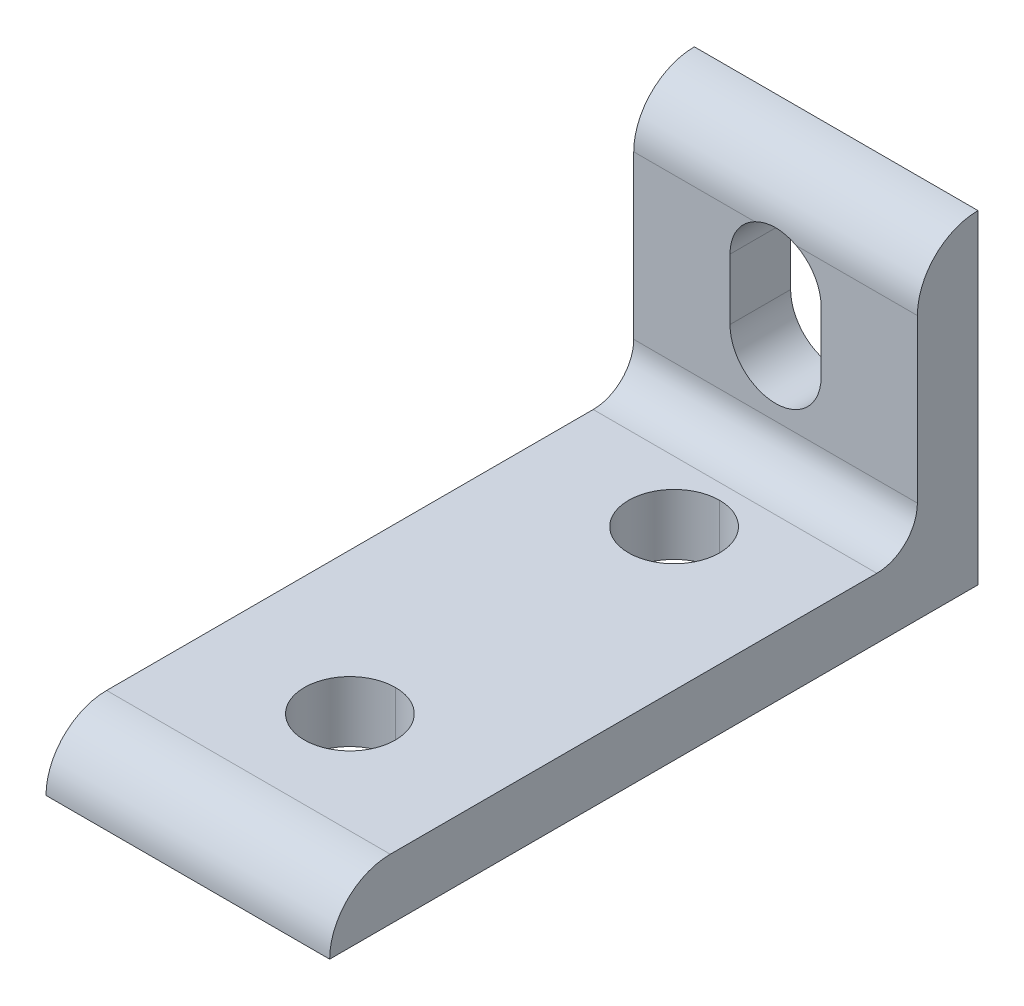
ISO-10303-21;
HEADER;
FILE_DESCRIPTION(('STEP AP214'),'2;1');
FILE_NAME('part.step','',(''),(''),'','','');
FILE_SCHEMA(('AUTOMOTIVE_DESIGN { 1 0 10303 214 1 1 1 1 }'));
ENDSEC;
DATA;
#1=APPLICATION_CONTEXT('core data for automotive mechanical design processes');
#2=APPLICATION_PROTOCOL_DEFINITION('international standard','automotive_design',2000,#1);
#3=PRODUCT_CONTEXT('',#1,'mechanical');
#4=PRODUCT('Part','Part','',(#3));
#5=PRODUCT_RELATED_PRODUCT_CATEGORY('part','',(#4));
#6=PRODUCT_DEFINITION_FORMATION('','',#4);
#7=PRODUCT_DEFINITION_CONTEXT('part definition',#1,'design');
#8=PRODUCT_DEFINITION('design','',#6,#7);
#9=PRODUCT_DEFINITION_SHAPE('','',#8);
#10=(LENGTH_UNIT() NAMED_UNIT(*) SI_UNIT(.MILLI.,.METRE.));
#11=(NAMED_UNIT(*) PLANE_ANGLE_UNIT() SI_UNIT($,.RADIAN.));
#12=(NAMED_UNIT(*) SI_UNIT($,.STERADIAN.) SOLID_ANGLE_UNIT());
#13=UNCERTAINTY_MEASURE_WITH_UNIT(LENGTH_MEASURE(1.E-05),#10,'distance_accuracy_value','');
#14=(GEOMETRIC_REPRESENTATION_CONTEXT(3) GLOBAL_UNCERTAINTY_ASSIGNED_CONTEXT((#13)) GLOBAL_UNIT_ASSIGNED_CONTEXT((#10,
#11,#12)) REPRESENTATION_CONTEXT('',''));
#15=CARTESIAN_POINT('',(0.,0.,0.));
#16=DIRECTION('',(0.,0.,1.));
#17=DIRECTION('',(1.,0.,0.));
#18=AXIS2_PLACEMENT_3D('',#15,#16,#17);
#19=CARTESIAN_POINT('',(11.1125,20.6501999999996,-3.83373888190875E-13));
#20=DIRECTION('',(-1.,0.,0.));
#21=DIRECTION('',(0.,-0.707106781186549,-0.707106781186546));
#22=AXIS2_PLACEMENT_3D('',#19,#20,#21);
#23=CYLINDRICAL_SURFACE('',#22,4.74980000000038);
#24=CARTESIAN_POINT('',(1.62941544426215,20.6502,4.7498));
#25=CARTESIAN_POINT('',(1.58771081475754,20.6716034856698,4.74979974663532));
#26=CARTESIAN_POINT('',(1.54558425612767,20.6921841983574,4.74966851430968));
#27=CARTESIAN_POINT('',(1.46044579112191,20.7317204261948,4.74919246835392));
#28=CARTESIAN_POINT('',(1.41743190130385,20.7506716639528,4.74884711102947));
#29=CARTESIAN_POINT('',(1.33061351037316,20.7868920036165,4.74799093163442));
#30=CARTESIAN_POINT('',(1.28680773953131,20.8041580547705,4.74747981645889));
#31=CARTESIAN_POINT('',(1.19850462397126,20.836959486562,4.74633992900316));
#32=CARTESIAN_POINT('',(1.15400663129361,20.8524931187037,4.74571103954002));
#33=CARTESIAN_POINT('',(1.06442158531662,20.8817888826184,4.74438361323167));
#34=CARTESIAN_POINT('',(1.0193344057291,20.8955506275045,4.74368506123472));
#35=CARTESIAN_POINT('',(0.928676402628855,20.921270030396,4.74226626330767));
#36=CARTESIAN_POINT('',(0.883105868220467,20.9332287081759,4.74154602991872));
#37=CARTESIAN_POINT('',(0.791588800347899,20.955317768452,4.74013228917699));
#38=CARTESIAN_POINT('',(0.745642860304988,20.9654506073167,4.7394387469192));
#39=CARTESIAN_POINT('',(0.653484208680454,20.9838723251786,4.73812544793173));
#40=CARTESIAN_POINT('',(0.607272280405272,20.9921651116181,4.73750553617148));
#41=CARTESIAN_POINT('',(0.514657127790422,21.0069052008294,4.73639155213394));
#42=CARTESIAN_POINT('',(0.46825454276931,21.0133564996596,4.73589720763457));
#43=CARTESIAN_POINT('',(0.375134719315914,21.0244388838199,4.73506581396674));
#44=CARTESIAN_POINT('',(0.328417031160237,21.0290662151868,4.73472908893554));
#45=CARTESIAN_POINT('',(0.234732091815051,21.0364825419295,4.73420023725051));
#46=CARTESIAN_POINT('',(0.187764518046458,21.0392674850632,4.7340084292038));
#47=CARTESIAN_POINT('',(0.0936895393163097,21.0429809694374,4.73376591374445));
#48=CARTESIAN_POINT('',(0.0465820306009302,21.0439068954656,4.73371540506853));
#49=CARTESIAN_POINT('',(-0.0476619701041502,21.0438930228934,4.73374970108751));
#50=CARTESIAN_POINT('',(-0.0947984618903732,21.0429520630801,4.73383458999398));
#51=CARTESIAN_POINT('',(-0.188989199584479,21.0392039144651,4.73413443720792));
#52=CARTESIAN_POINT('',(-0.236043457466747,21.0363970248882,4.73434937465999));
#53=CARTESIAN_POINT('',(-0.3299588028127,21.0289253361312,4.73490414345228));
#54=CARTESIAN_POINT('',(-0.376820030649899,21.0242622924687,4.7352438567583));
#55=CARTESIAN_POINT('',(-0.47023941085494,21.0130953812573,4.73604213350941));
#56=CARTESIAN_POINT('',(-0.516797947184081,21.0065947108632,4.73650049041925));
#57=CARTESIAN_POINT('',(-0.609503693282869,20.991778287716,4.7375333609251));
#58=CARTESIAN_POINT('',(-0.655651643786119,20.9834671487465,4.73810757899205));
#59=CARTESIAN_POINT('',(-0.7475553673972,20.965038941085,4.73935864458335));
#60=CARTESIAN_POINT('',(-0.79331135871949,20.9549229563624,4.74003543047012));
#61=CARTESIAN_POINT('',(-0.884478989736967,20.9328755701145,4.7414265065075));
#62=CARTESIAN_POINT('',(-0.929889770496905,20.9209406213697,4.74214086811328));
#63=CARTESIAN_POINT('',(-1.02025908404943,20.8952731110481,4.74355894802424));
#64=CARTESIAN_POINT('',(-1.06521701367042,20.8815384250336,4.74426265263708));
#65=CARTESIAN_POINT('',(-1.15457409774702,20.8522977382991,4.74560627284924));
#66=CARTESIAN_POINT('',(-1.19897302047046,20.8367910282061,4.74624616270905));
#67=CARTESIAN_POINT('',(-1.28710795782765,20.8040409555758,4.74741022276379));
#68=CARTESIAN_POINT('',(-1.33084421903748,20.7867982582136,4.74793443703802));
#69=CARTESIAN_POINT('',(-1.41755271520108,20.7506187491641,4.74881487388937));
#70=CARTESIAN_POINT('',(-1.46052577580067,20.7316839212114,4.74917129018523));
#71=CARTESIAN_POINT('',(-1.54561058696089,20.6921713333414,4.74966352331007));
#72=CARTESIAN_POINT('',(-1.58772383502101,20.6715968030771,4.749799763069));
#73=CARTESIAN_POINT('',(-1.62941544426216,20.6502,4.7498));
#74=B_SPLINE_CURVE_WITH_KNOTS('',3,(#24,#25,#26,#27,#28,#29,#30,#31,#32,#33,#34,#35,#36,#37,#38,
#39,#40,#41,#42,#43,#44,#45,#46,#47,#48,#49,#50,#51,#52,#53,#54,#55,#56,#57,#58,#59,#60,#61,#62,
#63,#64,#65,#66,#67,#68,#69,#70,#71,#72,#73),.UNSPECIFIED.,.F.,.F.,(4,2,2,2,2,2,2,2,2,2,2,2,2,2,
2,2,2,2,2,2,2,2,2,2,4),(0.,0.140619147105535,0.281596817120042,0.422825145757395,
0.564194747466598,0.70559516469195,0.846915306564409,0.988043882152585,1.12886983337309,
1.26938782549957,1.41019353053859,1.55130791016503,1.69262066678115,1.83402134823024,
1.97539935979175,2.1166439750222,2.25764434557146,2.39828951008736,2.5388504873747,
2.679689169978,2.82069562410569,2.96175872470758,3.10276797866124,3.24361403917691,
3.38418923013093),.UNSPECIFIED.);
#75=CARTESIAN_POINT('',(1.62941544426215,20.6502,4.7498));
#76=VERTEX_POINT('',#75);
#77=CARTESIAN_POINT('',(-1.62941544426215,20.6502,4.7498));
#78=VERTEX_POINT('',#77);
#79=EDGE_CURVE('E11',#76,#78,#74,.T.);
#80=ORIENTED_EDGE('',*,*,#79,.F.);
#81=DIRECTION('',(-1.,0.,0.));
#82=VECTOR('',#81,1.);
#83=CARTESIAN_POINT('',(11.1125,20.6502,4.7498));
#84=LINE('',#83,#82);
#85=CARTESIAN_POINT('',(11.1125,20.6502,4.7498));
#86=VERTEX_POINT('',#85);
#87=EDGE_CURVE('E26',#86,#76,#84,.T.);
#88=ORIENTED_EDGE('',*,*,#87,.F.);
#89=CARTESIAN_POINT('',(11.1125,20.6501999999996,-3.83373888190875E-13));
#90=DIRECTION('',(1.,0.,0.));
#91=DIRECTION('',(0.,0.,-1.));
#92=AXIS2_PLACEMENT_3D('',#89,#90,#91);
#93=CIRCLE('',#92,4.74980000000038);
#94=CARTESIAN_POINT('',(11.1125,25.4,0.));
#95=VERTEX_POINT('',#94);
#96=EDGE_CURVE('E239',#95,#86,#93,.T.);
#97=ORIENTED_EDGE('',*,*,#96,.F.);
#98=DIRECTION('',(-1.,0.,0.));
#99=VECTOR('',#98,1.);
#100=CARTESIAN_POINT('',(11.1125,25.4,0.));
#101=LINE('',#100,#99);
#102=CARTESIAN_POINT('',(-11.1125,25.4,0.));
#103=VERTEX_POINT('',#102);
#104=EDGE_CURVE('E235',#95,#103,#101,.T.);
#105=ORIENTED_EDGE('',*,*,#104,.T.);
#106=CARTESIAN_POINT('',(-11.1125,20.6501999999996,-3.83373888190875E-13));
#107=DIRECTION('',(1.,0.,0.));
#108=DIRECTION('',(0.,0.,-1.));
#109=AXIS2_PLACEMENT_3D('',#106,#107,#108);
#110=CIRCLE('',#109,4.74980000000038);
#111=CARTESIAN_POINT('',(-11.1125,20.6502,4.7498));
#112=VERTEX_POINT('',#111);
#113=EDGE_CURVE('E231',#103,#112,#110,.T.);
#114=ORIENTED_EDGE('',*,*,#113,.T.);
#115=DIRECTION('',(-1.,0.,0.));
#116=VECTOR('',#115,1.);
#117=CARTESIAN_POINT('',(11.1125,20.6502,4.7498));
#118=LINE('',#117,#116);
#119=EDGE_CURVE('E213',#78,#112,#118,.T.);
#120=ORIENTED_EDGE('',*,*,#119,.F.);
#121=EDGE_LOOP('',(#80,#88,#97,#105,#114,#120));
#122=FACE_BOUND('',#121,.T.);
#123=ADVANCED_FACE('F17',(#122),#23,.T.);
#124=CARTESIAN_POINT('',(11.1125,20.6502,4.7498));
#125=DIRECTION('',(0.,0.,-1.));
#126=DIRECTION('',(-1.,0.,0.));
#127=AXIS2_PLACEMENT_3D('',#124,#125,#126);
#128=PLANE('',#127);
#129=CARTESIAN_POINT('',(0.,17.4752,4.7498));
#130=DIRECTION('',(0.,0.,1.));
#131=DIRECTION('',(-1.,0.,0.));
#132=AXIS2_PLACEMENT_3D('',#129,#130,#131);
#133=CIRCLE('',#132,3.5687);
#134=CARTESIAN_POINT('',(3.5687,17.4752,4.7498));
#135=VERTEX_POINT('',#134);
#136=EDGE_CURVE('E209',#135,#76,#133,.T.);
#137=ORIENTED_EDGE('',*,*,#136,.F.);
#138=DIRECTION('',(0.,1.,0.));
#139=VECTOR('',#138,1.);
#140=CARTESIAN_POINT('',(3.5687,20.6502,4.7498));
#141=LINE('',#140,#139);
#142=CARTESIAN_POINT('',(3.5687,12.7,4.7498));
#143=VERTEX_POINT('',#142);
#144=EDGE_CURVE('E211',#143,#135,#141,.T.);
#145=ORIENTED_EDGE('',*,*,#144,.F.);
#146=CARTESIAN_POINT('',(0.,12.7,4.7498));
#147=DIRECTION('',(0.,0.,1.));
#148=DIRECTION('',(-1.,0.,0.));
#149=AXIS2_PLACEMENT_3D('',#146,#147,#148);
#150=CIRCLE('',#149,3.5687);
#151=CARTESIAN_POINT('',(-3.5687,12.7,4.7498));
#152=VERTEX_POINT('',#151);
#153=EDGE_CURVE('E218',#152,#143,#150,.T.);
#154=ORIENTED_EDGE('',*,*,#153,.F.);
#155=DIRECTION('',(0.,-1.,0.));
#156=VECTOR('',#155,1.);
#157=CARTESIAN_POINT('',(-3.5687,20.6502,4.7498));
#158=LINE('',#157,#156);
#159=CARTESIAN_POINT('',(-3.5687,17.4752,4.7498));
#160=VERTEX_POINT('',#159);
#161=EDGE_CURVE('E220',#160,#152,#158,.T.);
#162=ORIENTED_EDGE('',*,*,#161,.F.);
#163=CARTESIAN_POINT('',(0.,17.4752,4.7498));
#164=DIRECTION('',(0.,0.,1.));
#165=DIRECTION('',(-1.,0.,0.));
#166=AXIS2_PLACEMENT_3D('',#163,#164,#165);
#167=CIRCLE('',#166,3.5687);
#168=EDGE_CURVE('E152',#78,#160,#167,.T.);
#169=ORIENTED_EDGE('',*,*,#168,.F.);
#170=ORIENTED_EDGE('',*,*,#119,.T.);
#171=DIRECTION('',(0.,-1.,0.));
#172=VECTOR('',#171,1.);
#173=CARTESIAN_POINT('',(-11.1125,20.6502,4.7498));
#174=LINE('',#173,#172);
#175=CARTESIAN_POINT('',(-11.1125,7.9248,4.7498));
#176=VERTEX_POINT('',#175);
#177=EDGE_CURVE('E268',#112,#176,#174,.T.);
#178=ORIENTED_EDGE('',*,*,#177,.T.);
#179=DIRECTION('',(-1.,0.,0.));
#180=VECTOR('',#179,1.);
#181=CARTESIAN_POINT('',(11.1125,7.9248,4.7498));
#182=LINE('',#181,#180);
#183=CARTESIAN_POINT('',(11.1125,7.9248,4.7498));
#184=VERTEX_POINT('',#183);
#185=EDGE_CURVE('E344',#184,#176,#182,.T.);
#186=ORIENTED_EDGE('',*,*,#185,.F.);
#187=DIRECTION('',(0.,-1.,0.));
#188=VECTOR('',#187,1.);
#189=CARTESIAN_POINT('',(11.1125,20.6502,4.7498));
#190=LINE('',#189,#188);
#191=EDGE_CURVE('E257',#86,#184,#190,.T.);
#192=ORIENTED_EDGE('',*,*,#191,.F.);
#193=ORIENTED_EDGE('',*,*,#87,.T.);
#194=EDGE_LOOP('',(#137,#145,#154,#162,#169,#170,#178,#186,#192,#193));
#195=FACE_BOUND('',#194,.T.);
#196=ADVANCED_FACE('F201',(#195),#128,.F.);
#197=CARTESIAN_POINT('',(11.1125,4.80518402845576E-13,46.0502));
#198=DIRECTION('',(1.,0.,0.));
#199=DIRECTION('',(0.,0.,-1.));
#200=AXIS2_PLACEMENT_3D('',#197,#198,#199);
#201=PLANE('',#200);
#202=CARTESIAN_POINT('',(11.1125,4.80518402845576E-13,46.0502));
#203=DIRECTION('',(1.,0.,0.));
#204=DIRECTION('',(0.,0.,-1.));
#205=AXIS2_PLACEMENT_3D('',#202,#203,#204);
#206=CIRCLE('',#205,4.74979999999952);
#207=CARTESIAN_POINT('',(11.1125,4.7498,46.0502));
#208=VERTEX_POINT('',#207);
#209=CARTESIAN_POINT('',(11.1125,0.,50.8));
#210=VERTEX_POINT('',#209);
#211=EDGE_CURVE('E337',#208,#210,#206,.T.);
#212=ORIENTED_EDGE('',*,*,#211,.T.);
#213=DIRECTION('',(0.,0.,-1.));
#214=VECTOR('',#213,1.);
#215=CARTESIAN_POINT('',(11.1125,0.,50.8));
#216=LINE('',#215,#214);
#217=CARTESIAN_POINT('',(11.1125,0.,0.));
#218=VERTEX_POINT('',#217);
#219=EDGE_CURVE('E333',#210,#218,#216,.T.);
#220=ORIENTED_EDGE('',*,*,#219,.T.);
#221=DIRECTION('',(0.,1.,0.));
#222=VECTOR('',#221,1.);
#223=CARTESIAN_POINT('',(11.1125,0.,0.));
#224=LINE('',#223,#222);
#225=EDGE_CURVE('E259',#218,#95,#224,.T.);
#226=ORIENTED_EDGE('',*,*,#225,.T.);
#227=ORIENTED_EDGE('',*,*,#96,.T.);
#228=ORIENTED_EDGE('',*,*,#191,.T.);
#229=CARTESIAN_POINT('',(11.1125,7.92479999999986,7.92479999999986));
#230=DIRECTION('',(1.,0.,0.));
#231=DIRECTION('',(0.,0.,-1.));
#232=AXIS2_PLACEMENT_3D('',#229,#230,#231);
#233=CIRCLE('',#232,3.17499999999986);
#234=CARTESIAN_POINT('',(11.1125,4.7498,7.9248));
#235=VERTEX_POINT('',#234);
#236=EDGE_CURVE('E325',#235,#184,#233,.T.);
#237=ORIENTED_EDGE('',*,*,#236,.F.);
#238=DIRECTION('',(0.,0.,1.));
#239=VECTOR('',#238,1.);
#240=CARTESIAN_POINT('',(11.1125,4.7498,7.9248));
#241=LINE('',#240,#239);
#242=EDGE_CURVE('E321',#235,#208,#241,.T.);
#243=ORIENTED_EDGE('',*,*,#242,.T.);
#244=EDGE_LOOP('',(#212,#220,#226,#227,#228,#237,#243));
#245=FACE_BOUND('',#244,.T.);
#246=ADVANCED_FACE('F198',(#245),#201,.T.);
#247=CARTESIAN_POINT('',(11.1125,4.7498,7.9248));
#248=DIRECTION('',(0.,-1.,0.));
#249=DIRECTION('',(0.,0.,-1.));
#250=AXIS2_PLACEMENT_3D('',#247,#248,#249);
#251=PLANE('',#250);
#252=CARTESIAN_POINT('',(0.,4.7498,38.1));
#253=DIRECTION('',(0.,1.,0.));
#254=DIRECTION('',(0.,0.,-1.));
#255=AXIS2_PLACEMENT_3D('',#252,#253,#254);
#256=CIRCLE('',#255,3.5687);
#257=CARTESIAN_POINT('',(0.,4.7498,41.6687));
#258=VERTEX_POINT('',#257);
#259=CARTESIAN_POINT('',(0.,4.7498,34.5313));
#260=VERTEX_POINT('',#259);
#261=EDGE_CURVE('E316',#258,#260,#256,.T.);
#262=ORIENTED_EDGE('',*,*,#261,.F.);
#263=CARTESIAN_POINT('',(0.,4.7498,38.1));
#264=DIRECTION('',(0.,1.,0.));
#265=DIRECTION('',(0.,0.,-1.));
#266=AXIS2_PLACEMENT_3D('',#263,#264,#265);
#267=CIRCLE('',#266,3.5687);
#268=EDGE_CURVE('E311',#260,#258,#267,.T.);
#269=ORIENTED_EDGE('',*,*,#268,.F.);
#270=EDGE_LOOP('',(#262,#269));
#271=FACE_BOUND('',#270,.T.);
#272=CARTESIAN_POINT('',(0.,4.7498,12.7));
#273=DIRECTION('',(0.,1.,0.));
#274=DIRECTION('',(0.,0.,-1.));
#275=AXIS2_PLACEMENT_3D('',#272,#273,#274);
#276=CIRCLE('',#275,3.5687);
#277=CARTESIAN_POINT('',(0.,4.7498,16.2687));
#278=VERTEX_POINT('',#277);
#279=CARTESIAN_POINT('',(0.,4.7498,9.1313));
#280=VERTEX_POINT('',#279);
#281=EDGE_CURVE('E306',#278,#280,#276,.T.);
#282=ORIENTED_EDGE('',*,*,#281,.F.);
#283=CARTESIAN_POINT('',(0.,4.7498,12.7));
#284=DIRECTION('',(0.,1.,0.));
#285=DIRECTION('',(0.,0.,-1.));
#286=AXIS2_PLACEMENT_3D('',#283,#284,#285);
#287=CIRCLE('',#286,3.5687);
#288=EDGE_CURVE('E301',#280,#278,#287,.T.);
#289=ORIENTED_EDGE('',*,*,#288,.F.);
#290=EDGE_LOOP('',(#282,#289));
#291=FACE_BOUND('',#290,.T.);
#292=DIRECTION('',(0.,0.,1.));
#293=VECTOR('',#292,1.);
#294=CARTESIAN_POINT('',(-11.1125,4.7498,7.9248));
#295=LINE('',#294,#293);
#296=CARTESIAN_POINT('',(-11.1125,4.7498,7.9248));
#297=VERTEX_POINT('',#296);
#298=CARTESIAN_POINT('',(-11.1125,4.7498,46.0502));
#299=VERTEX_POINT('',#298);
#300=EDGE_CURVE('E297',#297,#299,#295,.T.);
#301=ORIENTED_EDGE('',*,*,#300,.T.);
#302=DIRECTION('',(-1.,0.,0.));
#303=VECTOR('',#302,1.);
#304=CARTESIAN_POINT('',(11.1125,4.7498,46.0502));
#305=LINE('',#304,#303);
#306=EDGE_CURVE('E292',#208,#299,#305,.T.);
#307=ORIENTED_EDGE('',*,*,#306,.F.);
#308=ORIENTED_EDGE('',*,*,#242,.F.);
#309=DIRECTION('',(-1.,0.,0.));
#310=VECTOR('',#309,1.);
#311=CARTESIAN_POINT('',(11.1125,4.7498,7.9248));
#312=LINE('',#311,#310);
#313=EDGE_CURVE('E288',#235,#297,#312,.T.);
#314=ORIENTED_EDGE('',*,*,#313,.T.);
#315=EDGE_LOOP('',(#301,#307,#308,#314));
#316=FACE_BOUND('',#315,.T.);
#317=ADVANCED_FACE('F194',(#271,#291,#316),#251,.F.);
#318=CARTESIAN_POINT('',(11.1125,7.92479999999986,7.92479999999986));
#319=DIRECTION('',(-1.,0.,0.));
#320=DIRECTION('',(0.,0.707106781186548,0.707106781186547));
#321=AXIS2_PLACEMENT_3D('',#318,#319,#320);
#322=CYLINDRICAL_SURFACE('',#321,3.17499999999986);
#323=CARTESIAN_POINT('',(-11.1125,7.92479999999986,7.92479999999986));
#324=DIRECTION('',(1.,0.,0.));
#325=DIRECTION('',(0.,0.,-1.));
#326=AXIS2_PLACEMENT_3D('',#323,#324,#325);
#327=CIRCLE('',#326,3.17499999999986);
#328=EDGE_CURVE('E276',#297,#176,#327,.T.);
#329=ORIENTED_EDGE('',*,*,#328,.F.);
#330=ORIENTED_EDGE('',*,*,#313,.F.);
#331=ORIENTED_EDGE('',*,*,#236,.T.);
#332=ORIENTED_EDGE('',*,*,#185,.T.);
#333=EDGE_LOOP('',(#329,#330,#331,#332));
#334=FACE_BOUND('',#333,.T.);
#335=ADVANCED_FACE('F190',(#334),#322,.F.);
#336=CARTESIAN_POINT('',(-11.1125,4.80518402845576E-13,46.0502));
#337=DIRECTION('',(1.,0.,0.));
#338=DIRECTION('',(0.,0.,-1.));
#339=AXIS2_PLACEMENT_3D('',#336,#337,#338);
#340=PLANE('',#339);
#341=CARTESIAN_POINT('',(-11.1125,4.80518402845576E-13,46.0502));
#342=DIRECTION('',(1.,0.,0.));
#343=DIRECTION('',(0.,0.,-1.));
#344=AXIS2_PLACEMENT_3D('',#341,#342,#343);
#345=CIRCLE('',#344,4.74979999999952);
#346=CARTESIAN_POINT('',(-11.1125,0.,50.8));
#347=VERTEX_POINT('',#346);
#348=EDGE_CURVE('E272',#299,#347,#345,.T.);
#349=ORIENTED_EDGE('',*,*,#348,.F.);
#350=ORIENTED_EDGE('',*,*,#300,.F.);
#351=ORIENTED_EDGE('',*,*,#328,.T.);
#352=ORIENTED_EDGE('',*,*,#177,.F.);
#353=ORIENTED_EDGE('',*,*,#113,.F.);
#354=DIRECTION('',(0.,1.,0.));
#355=VECTOR('',#354,1.);
#356=CARTESIAN_POINT('',(-11.1125,0.,0.));
#357=LINE('',#356,#355);
#358=CARTESIAN_POINT('',(-11.1125,0.,0.));
#359=VERTEX_POINT('',#358);
#360=EDGE_CURVE('E265',#359,#103,#357,.T.);
#361=ORIENTED_EDGE('',*,*,#360,.F.);
#362=DIRECTION('',(0.,0.,-1.));
#363=VECTOR('',#362,1.);
#364=CARTESIAN_POINT('',(-11.1125,0.,50.8));
#365=LINE('',#364,#363);
#366=EDGE_CURVE('E273',#347,#359,#365,.T.);
#367=ORIENTED_EDGE('',*,*,#366,.F.);
#368=EDGE_LOOP('',(#349,#350,#351,#352,#353,#361,#367));
#369=FACE_BOUND('',#368,.T.);
#370=ADVANCED_FACE('F186',(#369),#340,.F.);
#371=CARTESIAN_POINT('',(11.1125,0.,50.8));
#372=DIRECTION('',(0.,1.,0.));
#373=DIRECTION('',(0.,0.,1.));
#374=AXIS2_PLACEMENT_3D('',#371,#372,#373);
#375=PLANE('',#374);
#376=CARTESIAN_POINT('',(0.,0.,38.1));
#377=DIRECTION('',(0.,1.,0.));
#378=DIRECTION('',(1.,0.,0.));
#379=AXIS2_PLACEMENT_3D('',#376,#377,#378);
#380=CIRCLE('',#379,3.5687);
#381=CARTESIAN_POINT('',(0.,0.,34.5313));
#382=VERTEX_POINT('',#381);
#383=CARTESIAN_POINT('',(0.,0.,41.6687));
#384=VERTEX_POINT('',#383);
#385=EDGE_CURVE('E278',#382,#384,#380,.T.);
#386=ORIENTED_EDGE('',*,*,#385,.T.);
#387=CARTESIAN_POINT('',(0.,0.,38.1));
#388=DIRECTION('',(0.,1.,0.));
#389=DIRECTION('',(0.,0.,1.));
#390=AXIS2_PLACEMENT_3D('',#387,#388,#389);
#391=CIRCLE('',#390,3.5687);
#392=EDGE_CURVE('E392',#384,#382,#391,.T.);
#393=ORIENTED_EDGE('',*,*,#392,.T.);
#394=EDGE_LOOP('',(#386,#393));
#395=FACE_BOUND('',#394,.T.);
#396=CARTESIAN_POINT('',(0.,0.,12.7));
#397=DIRECTION('',(0.,1.,0.));
#398=DIRECTION('',(1.,0.,0.));
#399=AXIS2_PLACEMENT_3D('',#396,#397,#398);
#400=CIRCLE('',#399,3.5687);
#401=CARTESIAN_POINT('',(0.,0.,9.1313));
#402=VERTEX_POINT('',#401);
#403=CARTESIAN_POINT('',(0.,0.,16.2687));
#404=VERTEX_POINT('',#403);
#405=EDGE_CURVE('E397',#402,#404,#400,.T.);
#406=ORIENTED_EDGE('',*,*,#405,.T.);
#407=CARTESIAN_POINT('',(0.,0.,12.7));
#408=DIRECTION('',(0.,1.,0.));
#409=DIRECTION('',(0.,0.,1.));
#410=AXIS2_PLACEMENT_3D('',#407,#408,#409);
#411=CIRCLE('',#410,3.5687);
#412=EDGE_CURVE('E407',#404,#402,#411,.T.);
#413=ORIENTED_EDGE('',*,*,#412,.T.);
#414=EDGE_LOOP('',(#406,#413));
#415=FACE_BOUND('',#414,.T.);
#416=ORIENTED_EDGE('',*,*,#366,.T.);
#417=DIRECTION('',(-1.,0.,0.));
#418=VECTOR('',#417,1.);
#419=CARTESIAN_POINT('',(11.1125,0.,0.));
#420=LINE('',#419,#418);
#421=EDGE_CURVE('E270',#218,#359,#420,.T.);
#422=ORIENTED_EDGE('',*,*,#421,.F.);
#423=ORIENTED_EDGE('',*,*,#219,.F.);
#424=DIRECTION('',(-1.,0.,0.));
#425=VECTOR('',#424,1.);
#426=CARTESIAN_POINT('',(11.1125,0.,50.8));
#427=LINE('',#426,#425);
#428=EDGE_CURVE('E147',#210,#347,#427,.T.);
#429=ORIENTED_EDGE('',*,*,#428,.T.);
#430=EDGE_LOOP('',(#416,#422,#423,#429));
#431=FACE_BOUND('',#430,.T.);
#432=ADVANCED_FACE('F182',(#395,#415,#431),#375,.F.);
#433=CARTESIAN_POINT('',(11.1125,4.80518402845576E-13,46.0502));
#434=DIRECTION('',(-1.,0.,0.));
#435=DIRECTION('',(0.,-0.707106781186512,-0.707106781186583));
#436=AXIS2_PLACEMENT_3D('',#433,#434,#435);
#437=CYLINDRICAL_SURFACE('',#436,4.74979999999952);
#438=ORIENTED_EDGE('',*,*,#348,.T.);
#439=ORIENTED_EDGE('',*,*,#428,.F.);
#440=ORIENTED_EDGE('',*,*,#211,.F.);
#441=ORIENTED_EDGE('',*,*,#306,.T.);
#442=EDGE_LOOP('',(#438,#439,#440,#441));
#443=FACE_BOUND('',#442,.T.);
#444=ADVANCED_FACE('F179',(#443),#437,.T.);
#445=CARTESIAN_POINT('',(11.1125,0.,0.));
#446=DIRECTION('',(0.,0.,1.));
#447=DIRECTION('',(1.,0.,0.));
#448=AXIS2_PLACEMENT_3D('',#445,#446,#447);
#449=PLANE('',#448);
#450=DIRECTION('',(0.,-1.,0.));
#451=VECTOR('',#450,1.);
#452=CARTESIAN_POINT('',(-3.5687,17.4752,0.));
#453=LINE('',#452,#451);
#454=CARTESIAN_POINT('',(-3.5687,17.4752,0.));
#455=VERTEX_POINT('',#454);
#456=CARTESIAN_POINT('',(-3.5687,12.7,0.));
#457=VERTEX_POINT('',#456);
#458=EDGE_CURVE('E129',#455,#457,#453,.T.);
#459=ORIENTED_EDGE('',*,*,#458,.T.);
#460=CARTESIAN_POINT('',(0.,12.7,0.));
#461=DIRECTION('',(0.,0.,1.));
#462=DIRECTION('',(1.,0.,0.));
#463=AXIS2_PLACEMENT_3D('',#460,#461,#462);
#464=CIRCLE('',#463,3.5687);
#465=CARTESIAN_POINT('',(3.5687,12.7,0.));
#466=VERTEX_POINT('',#465);
#467=EDGE_CURVE('E148',#457,#466,#464,.T.);
#468=ORIENTED_EDGE('',*,*,#467,.T.);
#469=DIRECTION('',(0.,1.,0.));
#470=VECTOR('',#469,1.);
#471=CARTESIAN_POINT('',(3.5687,12.7,0.));
#472=LINE('',#471,#470);
#473=CARTESIAN_POINT('',(3.5687,17.4752,0.));
#474=VERTEX_POINT('',#473);
#475=EDGE_CURVE('E132',#466,#474,#472,.T.);
#476=ORIENTED_EDGE('',*,*,#475,.T.);
#477=CARTESIAN_POINT('',(0.,17.4752,0.));
#478=DIRECTION('',(0.,0.,1.));
#479=DIRECTION('',(1.,0.,0.));
#480=AXIS2_PLACEMENT_3D('',#477,#478,#479);
#481=CIRCLE('',#480,3.5687);
#482=EDGE_CURVE('E125',#474,#455,#481,.T.);
#483=ORIENTED_EDGE('',*,*,#482,.T.);
#484=EDGE_LOOP('',(#459,#468,#476,#483));
#485=FACE_BOUND('',#484,.T.);
#486=ORIENTED_EDGE('',*,*,#360,.T.);
#487=ORIENTED_EDGE('',*,*,#104,.F.);
#488=ORIENTED_EDGE('',*,*,#225,.F.);
#489=ORIENTED_EDGE('',*,*,#421,.T.);
#490=EDGE_LOOP('',(#486,#487,#488,#489));
#491=FACE_BOUND('',#490,.T.);
#492=ADVANCED_FACE('F127',(#485,#491),#449,.F.);
#493=CARTESIAN_POINT('',(0.,17.4752,7.9248));
#494=DIRECTION('',(0.,0.,-1.));
#495=DIRECTION('',(0.,-1.,0.));
#496=AXIS2_PLACEMENT_3D('',#493,#494,#495);
#497=CYLINDRICAL_SURFACE('',#496,3.5687);
#498=ORIENTED_EDGE('',*,*,#136,.T.);
#499=ORIENTED_EDGE('',*,*,#79,.T.);
#500=ORIENTED_EDGE('',*,*,#168,.T.);
#501=DIRECTION('',(0.,0.,-1.));
#502=VECTOR('',#501,1.);
#503=CARTESIAN_POINT('',(-3.5687,17.4752,7.9248));
#504=LINE('',#503,#502);
#505=EDGE_CURVE('E137',#160,#455,#504,.T.);
#506=ORIENTED_EDGE('',*,*,#505,.T.);
#507=ORIENTED_EDGE('',*,*,#482,.F.);
#508=DIRECTION('',(0.,0.,-1.));
#509=VECTOR('',#508,1.);
#510=CARTESIAN_POINT('',(3.5687,17.4752,7.9248));
#511=LINE('',#510,#509);
#512=EDGE_CURVE('E153',#135,#474,#511,.T.);
#513=ORIENTED_EDGE('',*,*,#512,.F.);
#514=EDGE_LOOP('',(#498,#499,#500,#506,#507,#513));
#515=FACE_BOUND('',#514,.T.);
#516=ADVANCED_FACE('F150',(#515),#497,.F.);
#517=CARTESIAN_POINT('',(3.5687,12.7,7.9248));
#518=DIRECTION('',(-1.,0.,0.));
#519=DIRECTION('',(0.,0.,1.));
#520=AXIS2_PLACEMENT_3D('',#517,#518,#519);
#521=PLANE('',#520);
#522=ORIENTED_EDGE('',*,*,#144,.T.);
#523=ORIENTED_EDGE('',*,*,#512,.T.);
#524=ORIENTED_EDGE('',*,*,#475,.F.);
#525=DIRECTION('',(0.,0.,-1.));
#526=VECTOR('',#525,1.);
#527=CARTESIAN_POINT('',(3.5687,12.7,7.9248));
#528=LINE('',#527,#526);
#529=EDGE_CURVE('E155',#143,#466,#528,.T.);
#530=ORIENTED_EDGE('',*,*,#529,.F.);
#531=EDGE_LOOP('',(#522,#523,#524,#530));
#532=FACE_BOUND('',#531,.T.);
#533=ADVANCED_FACE('F175',(#532),#521,.T.);
#534=CARTESIAN_POINT('',(0.,12.7,7.9248));
#535=DIRECTION('',(0.,0.,-1.));
#536=DIRECTION('',(0.,1.,0.));
#537=AXIS2_PLACEMENT_3D('',#534,#535,#536);
#538=CYLINDRICAL_SURFACE('',#537,3.5687);
#539=ORIENTED_EDGE('',*,*,#153,.T.);
#540=ORIENTED_EDGE('',*,*,#529,.T.);
#541=ORIENTED_EDGE('',*,*,#467,.F.);
#542=DIRECTION('',(0.,0.,-1.));
#543=VECTOR('',#542,1.);
#544=CARTESIAN_POINT('',(-3.5687,12.7,7.9248));
#545=LINE('',#544,#543);
#546=EDGE_CURVE('E145',#152,#457,#545,.T.);
#547=ORIENTED_EDGE('',*,*,#546,.F.);
#548=EDGE_LOOP('',(#539,#540,#541,#547));
#549=FACE_BOUND('',#548,.T.);
#550=ADVANCED_FACE('F360',(#549),#538,.F.);
#551=CARTESIAN_POINT('',(-3.5687,17.4752,7.9248));
#552=DIRECTION('',(1.,0.,0.));
#553=DIRECTION('',(0.,0.,-1.));
#554=AXIS2_PLACEMENT_3D('',#551,#552,#553);
#555=PLANE('',#554);
#556=ORIENTED_EDGE('',*,*,#161,.T.);
#557=ORIENTED_EDGE('',*,*,#546,.T.);
#558=ORIENTED_EDGE('',*,*,#458,.F.);
#559=ORIENTED_EDGE('',*,*,#505,.F.);
#560=EDGE_LOOP('',(#556,#557,#558,#559));
#561=FACE_BOUND('',#560,.T.);
#562=ADVANCED_FACE('F142',(#561),#555,.T.);
#563=CARTESIAN_POINT('',(0.,7.9248,12.7));
#564=DIRECTION('',(0.,-1.,0.));
#565=DIRECTION('',(-1.,0.,0.));
#566=AXIS2_PLACEMENT_3D('',#563,#564,#565);
#567=CYLINDRICAL_SURFACE('',#566,3.5687);
#568=DIRECTION('',(0.,-1.,0.));
#569=VECTOR('',#568,1.);
#570=CARTESIAN_POINT('',(0.,4.7498,16.2687));
#571=LINE('',#570,#569);
#572=EDGE_CURVE('E361',#278,#404,#571,.T.);
#573=ORIENTED_EDGE('',*,*,#572,.F.);
#574=ORIENTED_EDGE('',*,*,#281,.T.);
#575=DIRECTION('',(0.,-1.,0.));
#576=VECTOR('',#575,1.);
#577=CARTESIAN_POINT('',(0.,4.7498,9.1313));
#578=LINE('',#577,#576);
#579=EDGE_CURVE('E365',#280,#402,#578,.T.);
#580=ORIENTED_EDGE('',*,*,#579,.T.);
#581=ORIENTED_EDGE('',*,*,#412,.F.);
#582=EDGE_LOOP('',(#573,#574,#580,#581));
#583=FACE_BOUND('',#582,.T.);
#584=ADVANCED_FACE('F445',(#583),#567,.F.);
#585=CARTESIAN_POINT('',(0.,7.9248,12.7));
#586=DIRECTION('',(0.,-1.,0.));
#587=DIRECTION('',(1.,0.,0.));
#588=AXIS2_PLACEMENT_3D('',#585,#586,#587);
#589=CYLINDRICAL_SURFACE('',#588,3.5687);
#590=ORIENTED_EDGE('',*,*,#572,.T.);
#591=ORIENTED_EDGE('',*,*,#405,.F.);
#592=ORIENTED_EDGE('',*,*,#579,.F.);
#593=ORIENTED_EDGE('',*,*,#288,.T.);
#594=EDGE_LOOP('',(#590,#591,#592,#593));
#595=FACE_BOUND('',#594,.T.);
#596=ADVANCED_FACE('F444',(#595),#589,.F.);
#597=CARTESIAN_POINT('',(0.,7.9248,38.1));
#598=DIRECTION('',(0.,-1.,0.));
#599=DIRECTION('',(-1.,0.,0.));
#600=AXIS2_PLACEMENT_3D('',#597,#598,#599);
#601=CYLINDRICAL_SURFACE('',#600,3.5687);
#602=DIRECTION('',(0.,-1.,0.));
#603=VECTOR('',#602,1.);
#604=CARTESIAN_POINT('',(0.,4.7498,41.6687));
#605=LINE('',#604,#603);
#606=EDGE_CURVE('E378',#258,#384,#605,.T.);
#607=ORIENTED_EDGE('',*,*,#606,.F.);
#608=ORIENTED_EDGE('',*,*,#261,.T.);
#609=DIRECTION('',(0.,-1.,0.));
#610=VECTOR('',#609,1.);
#611=CARTESIAN_POINT('',(0.,4.7498,34.5313));
#612=LINE('',#611,#610);
#613=EDGE_CURVE('E383',#260,#382,#612,.T.);
#614=ORIENTED_EDGE('',*,*,#613,.T.);
#615=ORIENTED_EDGE('',*,*,#392,.F.);
#616=EDGE_LOOP('',(#607,#608,#614,#615));
#617=FACE_BOUND('',#616,.T.);
#618=ADVANCED_FACE('F391',(#617),#601,.F.);
#619=CARTESIAN_POINT('',(0.,7.9248,38.1));
#620=DIRECTION('',(0.,-1.,0.));
#621=DIRECTION('',(1.,0.,0.));
#622=AXIS2_PLACEMENT_3D('',#619,#620,#621);
#623=CYLINDRICAL_SURFACE('',#622,3.5687);
#624=ORIENTED_EDGE('',*,*,#606,.T.);
#625=ORIENTED_EDGE('',*,*,#385,.F.);
#626=ORIENTED_EDGE('',*,*,#613,.F.);
#627=ORIENTED_EDGE('',*,*,#268,.T.);
#628=EDGE_LOOP('',(#624,#625,#626,#627));
#629=FACE_BOUND('',#628,.T.);
#630=ADVANCED_FACE('F395',(#629),#623,.F.);
#631=CLOSED_SHELL('',(#123,#196,#246,#317,#335,#370,#432,#444,#492,#516,#533,#550,#562,#584,
#596,#618,#630));
#632=MANIFOLD_SOLID_BREP('B1',#631);
#633=ADVANCED_BREP_SHAPE_REPRESENTATION('',(#18,#632),#14);
#634=SHAPE_DEFINITION_REPRESENTATION(#9,#633);
ENDSEC;
END-ISO-10303-21;
